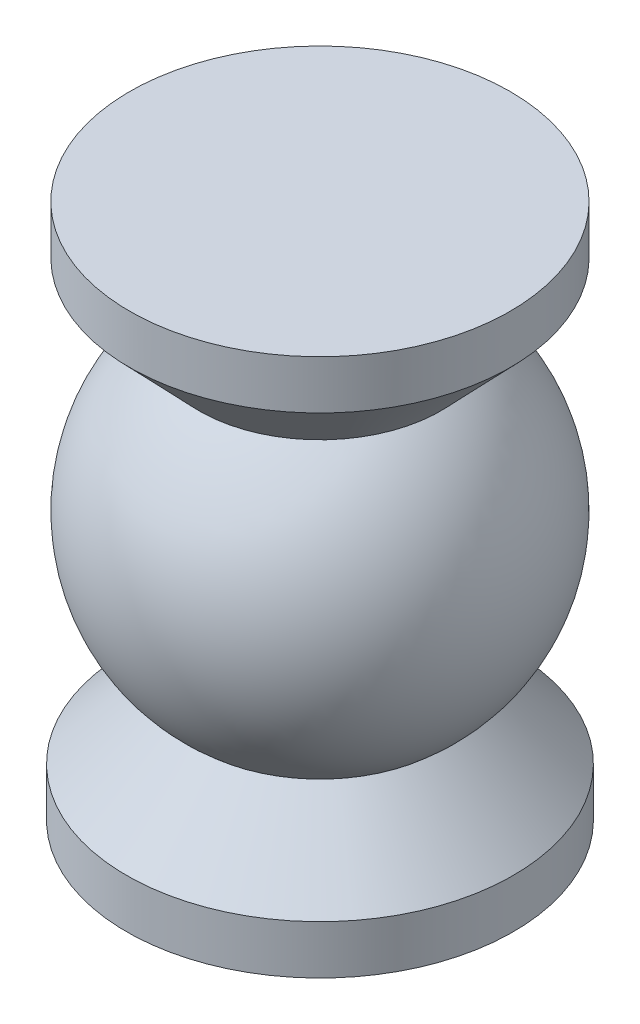
ISO-10303-21;
HEADER;
FILE_DESCRIPTION(('STEP AP214'),'2;1');
FILE_NAME('part.step','',(''),(''),'','','');
FILE_SCHEMA(('AUTOMOTIVE_DESIGN { 1 0 10303 214 1 1 1 1 }'));
ENDSEC;
DATA;
#1=APPLICATION_CONTEXT('core data for automotive mechanical design processes');
#2=APPLICATION_PROTOCOL_DEFINITION('international standard','automotive_design',2000,#1);
#3=PRODUCT_CONTEXT('',#1,'mechanical');
#4=PRODUCT('Part','Part','',(#3));
#5=PRODUCT_RELATED_PRODUCT_CATEGORY('part','',(#4));
#6=PRODUCT_DEFINITION_FORMATION('','',#4);
#7=PRODUCT_DEFINITION_CONTEXT('part definition',#1,'design');
#8=PRODUCT_DEFINITION('design','',#6,#7);
#9=PRODUCT_DEFINITION_SHAPE('','',#8);
#10=(LENGTH_UNIT() NAMED_UNIT(*) SI_UNIT(.MILLI.,.METRE.));
#11=(NAMED_UNIT(*) PLANE_ANGLE_UNIT() SI_UNIT($,.RADIAN.));
#12=(NAMED_UNIT(*) SI_UNIT($,.STERADIAN.) SOLID_ANGLE_UNIT());
#13=UNCERTAINTY_MEASURE_WITH_UNIT(LENGTH_MEASURE(1.E-05),#10,'distance_accuracy_value','');
#14=(GEOMETRIC_REPRESENTATION_CONTEXT(3) GLOBAL_UNCERTAINTY_ASSIGNED_CONTEXT((#13)) GLOBAL_UNIT_ASSIGNED_CONTEXT((#10,
#11,#12)) REPRESENTATION_CONTEXT('',''));
#15=CARTESIAN_POINT('',(0.,0.,0.));
#16=DIRECTION('',(0.,0.,1.));
#17=DIRECTION('',(1.,0.,0.));
#18=AXIS2_PLACEMENT_3D('',#15,#16,#17);
#19=CARTESIAN_POINT('',(-25.4000000000001,-34.4016735588106,0.));
#20=DIRECTION('',(0.,1.,0.));
#21=DIRECTION('',(0.,0.,1.));
#22=AXIS2_PLACEMENT_3D('',#19,#20,#21);
#23=PLANE('',#22);
#24=CARTESIAN_POINT('',(-1.00000000000001,-34.4016735588095,0.));
#25=DIRECTION('',(0.,-1.,0.));
#26=DIRECTION('',(0.,0.,-1.));
#27=AXIS2_PLACEMENT_3D('',#24,#25,#26);
#28=CIRCLE('',#27,25.4);
#29=CARTESIAN_POINT('',(-1.00000000000001,-34.4016735588095,-25.4));
#30=VERTEX_POINT('',#29);
#31=EDGE_CURVE('E94',#30,#30,#28,.T.);
#32=ORIENTED_EDGE('',*,*,#31,.T.);
#33=EDGE_LOOP('',(#32));
#34=FACE_BOUND('',#33,.T.);
#35=ADVANCED_FACE('F42',(#34),#23,.F.);
#36=CARTESIAN_POINT('',(-25.,36.0016735588097,0.));
#37=DIRECTION('',(0.,-1.,0.));
#38=DIRECTION('',(0.,0.,-1.));
#39=AXIS2_PLACEMENT_3D('',#36,#37,#38);
#40=PLANE('',#39);
#41=CARTESIAN_POINT('',(-1.00000000000001,36.0016735588097,0.));
#42=DIRECTION('',(0.,-1.,0.));
#43=DIRECTION('',(0.,0.,-1.));
#44=AXIS2_PLACEMENT_3D('',#41,#42,#43);
#45=CIRCLE('',#44,25.);
#46=CARTESIAN_POINT('',(-1.00000000000001,36.0016735588097,-25.));
#47=VERTEX_POINT('',#46);
#48=EDGE_CURVE('E74',#47,#47,#45,.T.);
#49=ORIENTED_EDGE('',*,*,#48,.F.);
#50=EDGE_LOOP('',(#49));
#51=FACE_BOUND('',#50,.T.);
#52=ADVANCED_FACE('F127',(#51),#40,.F.);
#53=CARTESIAN_POINT('',(-1.00000000000001,-999.2,0.));
#54=DIRECTION('',(0.,-1.,0.));
#55=DIRECTION('',(0.,0.,-1.));
#56=AXIS2_PLACEMENT_3D('',#53,#54,#55);
#57=CYLINDRICAL_SURFACE('',#56,25.);
#58=CARTESIAN_POINT('',(-1.00000000000001,29.5994118364477,0.));
#59=DIRECTION('',(0.,-1.,0.));
#60=DIRECTION('',(0.,0.,-1.));
#61=AXIS2_PLACEMENT_3D('',#58,#59,#60);
#62=CIRCLE('',#61,25.);
#63=CARTESIAN_POINT('',(-1.00000000000001,29.5994118364477,-25.));
#64=VERTEX_POINT('',#63);
#65=EDGE_CURVE('E78',#64,#64,#62,.T.);
#66=ORIENTED_EDGE('',*,*,#65,.F.);
#67=EDGE_LOOP('',(#66));
#68=FACE_BOUND('',#67,.T.);
#69=ORIENTED_EDGE('',*,*,#48,.T.);
#70=EDGE_LOOP('',(#69));
#71=FACE_BOUND('',#70,.T.);
#72=ADVANCED_FACE('F121',(#68,#71),#57,.T.);
#73=CARTESIAN_POINT('',(-1.00000000000001,29.5994118364477,0.));
#74=DIRECTION('',(0.,1.,0.));
#75=DIRECTION('',(0.,0.,1.));
#76=AXIS2_PLACEMENT_3D('',#73,#74,#75);
#77=CONICAL_SURFACE('',#76,25.,0.764909231725156);
#78=CARTESIAN_POINT('',(-1.00000000000001,20.1038960149712,0.));
#79=DIRECTION('',(0.,-1.,0.));
#80=DIRECTION('',(0.,0.,-1.));
#81=AXIS2_PLACEMENT_3D('',#78,#79,#80);
#82=CIRCLE('',#81,15.8858301213118);
#83=CARTESIAN_POINT('',(-16.8858301213119,20.1038960149712,0.));
#84=VERTEX_POINT('',#83);
#85=EDGE_CURVE('E82',#84,#84,#82,.T.);
#86=ORIENTED_EDGE('',*,*,#85,.F.);
#87=EDGE_LOOP('',(#86));
#88=FACE_BOUND('',#87,.T.);
#89=ORIENTED_EDGE('',*,*,#65,.T.);
#90=EDGE_LOOP('',(#89));
#91=FACE_BOUND('',#90,.T.);
#92=ADVANCED_FACE('F115',(#88,#91),#77,.T.);
#93=CARTESIAN_POINT('',(-1.00000000000001,0.800000000000002,0.));
#94=DIRECTION('',(0.,-1.,0.));
#95=DIRECTION('',(-1.,0.,0.));
#96=AXIS2_PLACEMENT_3D('',#93,#94,#95);
#97=SPHERICAL_SURFACE('',#96,25.);
#98=CARTESIAN_POINT('',(-1.00000000000001,-18.4893767310248,0.));
#99=DIRECTION('',(0.,-1.,0.));
#100=DIRECTION('',(0.,0.,-1.));
#101=AXIS2_PLACEMENT_3D('',#98,#99,#100);
#102=CIRCLE('',#101,15.9034570244522);
#103=CARTESIAN_POINT('',(-16.9034570244522,-18.4893767310248,0.));
#104=VERTEX_POINT('',#103);
#105=EDGE_CURVE('E86',#104,#104,#102,.T.);
#106=CARTESIAN_POINT('',(-16.9034570244522,-18.4893767310248,0.));
#107=CARTESIAN_POINT('',(-17.2578162967949,-18.1972370215747,0.));
#108=CARTESIAN_POINT('',(-17.6041070476047,-17.8953130350602,0.));
#109=CARTESIAN_POINT('',(-18.2795410880184,-17.2728578335224,0.));
#110=CARTESIAN_POINT('',(-18.6086843776225,-16.9523266184991,0.));
#111=CARTESIAN_POINT('',(-19.248813077485,-16.2936182855634,0.));
#112=CARTESIAN_POINT('',(-19.5597984877436,-15.9554411676511,0.));
#113=CARTESIAN_POINT('',(-20.1626700968582,-15.2624710737412,0.));
#114=CARTESIAN_POINT('',(-20.4545562957143,-14.9076780977437,0.));
#115=CARTESIAN_POINT('',(-21.0183424048437,-14.1825527286201,0.));
#116=CARTESIAN_POINT('',(-21.2902423151171,-13.8122203354942,0.));
#117=CARTESIAN_POINT('',(-21.8132304581927,-13.0571408440929,0.));
#118=CARTESIAN_POINT('',(-22.0643186909949,-12.6723937458177,0.));
#119=CARTESIAN_POINT('',(-22.5449210147059,-11.8896530338616,0.));
#120=CARTESIAN_POINT('',(-22.7744351056147,-11.4916594201808,0.));
#121=CARTESIAN_POINT('',(-23.2111922610482,-10.6836341670934,0.));
#122=CARTESIAN_POINT('',(-23.4184353255729,-10.2736025276869,0.));
#123=CARTESIAN_POINT('',(-23.8100211485234,-9.44274624434213,0.));
#124=CARTESIAN_POINT('',(-23.9943639069492,-9.02192160040382,0.));
#125=CARTESIAN_POINT('',(-24.3395893779495,-8.17075710681688,0.));
#126=CARTESIAN_POINT('',(-24.500472090524,-7.74041725716827,0.));
#127=CARTESIAN_POINT('',(-24.798288963086,-6.87152904158024,0.));
#128=CARTESIAN_POINT('',(-24.9352231230736,-6.43298067564083,0.));
#129=CARTESIAN_POINT('',(-25.1847271018055,-5.5490070417428,0.));
#130=CARTESIAN_POINT('',(-25.29729692055,-5.10358177378418,0.));
#131=CARTESIAN_POINT('',(-25.4977304082555,-4.2072068311298,0.));
#132=CARTESIAN_POINT('',(-25.5855940772166,-3.75625715643403,0.));
#133=CARTESIAN_POINT('',(-25.7363484749288,-2.85020266999959,0.));
#134=CARTESIAN_POINT('',(-25.7992392036799,-2.39509785826091,0.));
#135=CARTESIAN_POINT('',(-25.8998567587118,-1.48211498414141,0.));
#136=CARTESIAN_POINT('',(-25.9375835849926,-1.0242369217606,0.));
#137=CARTESIAN_POINT('',(-25.9877587808388,-0.107097853495433,0.));
#138=CARTESIAN_POINT('',(-26.0002071504043,0.352163152388925,0.));
#139=CARTESIAN_POINT('',(-25.9997876344222,1.27067360133477,0.));
#140=CARTESIAN_POINT('',(-25.9869197488747,1.72992304439626,0.));
#141=CARTESIAN_POINT('',(-25.9359067948883,2.64701589647946,0.));
#142=CARTESIAN_POINT('',(-25.8977617264495,3.10485930550117,0.));
#143=CARTESIAN_POINT('',(-25.7963102308817,4.01774988758816,0.));
#144=CARTESIAN_POINT('',(-25.7330038037526,4.47279706065344,0.));
#145=CARTESIAN_POINT('',(-25.5814218152969,5.37871345944163,0.));
#146=CARTESIAN_POINT('',(-25.4931462539702,5.82958268516454,0.));
#147=CARTESIAN_POINT('',(-25.2918940382213,6.72577416385011,0.));
#148=CARTESIAN_POINT('',(-25.1789173837991,7.17109641681276,0.));
#149=CARTESIAN_POINT('',(-24.9286060257208,8.0548417674919,0.));
#150=CARTESIAN_POINT('',(-24.7912713220648,8.49326486520838,0.));
#151=CARTESIAN_POINT('',(-24.4926608703911,9.36188067148964,0.));
#152=CARTESIAN_POINT('',(-24.3313851223736,9.79207338005442,0.));
#153=CARTESIAN_POINT('',(-23.9853822821305,10.6429221653942,0.));
#154=CARTESIAN_POINT('',(-23.8006551899049,11.0635782421692,0.));
#155=CARTESIAN_POINT('',(-23.4083105679957,11.8940764769466,0.));
#156=CARTESIAN_POINT('',(-23.200693038312,12.3039186349489,0.));
#157=CARTESIAN_POINT('',(-22.7631979582284,13.1115445863347,0.));
#158=CARTESIAN_POINT('',(-22.5333204078285,13.5093283797181,0.));
#159=CARTESIAN_POINT('',(-22.0520032744313,14.2916297492735,0.));
#160=CARTESIAN_POINT('',(-21.800563691434,14.6761473254455,0.));
#161=CARTESIAN_POINT('',(-21.2768860240528,15.4307487678099,0.));
#162=CARTESIAN_POINT('',(-21.0046479396688,15.8008326340024,0.));
#163=CARTESIAN_POINT('',(-20.4401996854488,16.5254426988663,0.));
#164=CARTESIAN_POINT('',(-20.1479895156129,16.8799688975376,0.));
#165=CARTESIAN_POINT('',(-19.5444851505958,17.5723879971696,0.));
#166=CARTESIAN_POINT('',(-19.2331909554146,17.9102808981303,0.));
#167=CARTESIAN_POINT('',(-18.5924608122864,18.5684042178459,0.));
#168=CARTESIAN_POINT('',(-18.2630248643393,18.8886346366008,0.));
#169=CARTESIAN_POINT('',(-17.5870225115396,19.5104725896725,0.));
#170=CARTESIAN_POINT('',(-17.240456106687,19.8120801239894,0.));
#171=CARTESIAN_POINT('',(-16.8858301213119,20.1038960149712,0.));
#172=B_SPLINE_CURVE_WITH_KNOTS('',3,(#106,#107,#108,#109,#110,#111,#112,#113,#114,#115,#116,
#117,#118,#119,#120,#121,#122,#123,#124,#125,#126,#127,#128,#129,#130,#131,#132,#133,#134,#135,
#136,#137,#138,#139,#140,#141,#142,#143,#144,#145,#146,#147,#148,#149,#150,#151,#152,#153,#154,
#155,#156,#157,#158,#159,#160,#161,#162,#163,#164,#165,#166,#167,#168,#169,#170,#171),
.UNSPECIFIED.,.F.,.F.,(4,2,2,2,2,2,2,2,2,2,2,2,2,2,2,2,2,2,2,2,2,2,2,2,2,2,2,2,2,2,2,2,4),(0.,
1.37759153912765,2.75518307825531,4.13277461738296,5.51036615651061,6.88795769563826,
8.26554923476592,9.64314077389357,11.0207323130212,12.3983238521489,13.7759153912765,
15.1535069304042,16.5310984695318,17.9086900086595,19.2862815477871,20.6638730869148,
22.0414646260424,23.4190561651701,24.7966477042977,26.1742392434254,27.5518307825531,
28.9294223216807,30.3070138608084,31.684605399936,33.0621969390637,34.4397884781913,
35.817380017319,37.1949715564466,38.5725630955743,39.9501546347019,41.3277461738296,
42.7053377129572,44.0829292520849),.UNSPECIFIED.);
#173=EDGE_CURVE('BSEAM109',#104,#84,#172,.T.);
#174=ORIENTED_EDGE('',*,*,#105,.F.);
#175=ORIENTED_EDGE('',*,*,#85,.T.);
#176=ORIENTED_EDGE('',*,*,#173,.T.);
#177=ORIENTED_EDGE('',*,*,#173,.F.);
#178=EDGE_LOOP('',(#174,#176,#175,#177));
#179=FACE_BOUND('',#178,.T.);
#180=ADVANCED_FACE('F109',(#179),#97,.T.);
#181=CARTESIAN_POINT('',(-1.00000000000001,-18.4893767310248,0.));
#182=DIRECTION('',(0.,-1.,0.));
#183=DIRECTION('',(0.,0.,-1.));
#184=AXIS2_PLACEMENT_3D('',#181,#182,#183);
#185=CONICAL_SURFACE('',#184,15.9034570244522,0.785314492458571);
#186=CARTESIAN_POINT('',(-1.00000000000001,-27.9875090088885,0.));
#187=DIRECTION('',(0.,-1.,0.));
#188=DIRECTION('',(0.,0.,-1.));
#189=AXIS2_PLACEMENT_3D('',#186,#187,#188);
#190=CIRCLE('',#189,25.4);
#191=CARTESIAN_POINT('',(-1.00000000000001,-27.9875090088885,-25.4));
#192=VERTEX_POINT('',#191);
#193=EDGE_CURVE('E90',#192,#192,#190,.T.);
#194=ORIENTED_EDGE('',*,*,#193,.F.);
#195=EDGE_LOOP('',(#194));
#196=FACE_BOUND('',#195,.T.);
#197=ORIENTED_EDGE('',*,*,#105,.T.);
#198=EDGE_LOOP('',(#197));
#199=FACE_BOUND('',#198,.T.);
#200=ADVANCED_FACE('F103',(#196,#199),#185,.T.);
#201=CARTESIAN_POINT('',(-1.00000000000001,-999.2,0.));
#202=DIRECTION('',(0.,-1.,0.));
#203=DIRECTION('',(0.,0.,-1.));
#204=AXIS2_PLACEMENT_3D('',#201,#202,#203);
#205=CYLINDRICAL_SURFACE('',#204,25.4);
#206=ORIENTED_EDGE('',*,*,#31,.F.);
#207=EDGE_LOOP('',(#206));
#208=FACE_BOUND('',#207,.T.);
#209=ORIENTED_EDGE('',*,*,#193,.T.);
#210=EDGE_LOOP('',(#209));
#211=FACE_BOUND('',#210,.T.);
#212=ADVANCED_FACE('F100',(#208,#211),#205,.T.);
#213=CLOSED_SHELL('',(#35,#52,#72,#92,#180,#200,#212));
#214=CARTESIAN_POINT('',(-25.4,-33.4016735588106,0.));
#215=DIRECTION('',(0.,1.,0.));
#216=DIRECTION('',(0.,0.,1.));
#217=AXIS2_PLACEMENT_3D('',#214,#215,#216);
#218=PLANE('',#217);
#219=CARTESIAN_POINT('',(-1.00000000000001,-33.4016735588096,0.));
#220=DIRECTION('',(0.,-1.,0.));
#221=DIRECTION('',(0.,0.,-1.));
#222=AXIS2_PLACEMENT_3D('',#219,#220,#221);
#223=CIRCLE('',#222,24.4);
#224=CARTESIAN_POINT('',(-1.00000000000001,-33.4016735588096,-24.4));
#225=VERTEX_POINT('',#224);
#226=EDGE_CURVE('E10',#225,#225,#223,.T.);
#227=ORIENTED_EDGE('',*,*,#226,.F.);
#228=EDGE_LOOP('',(#227));
#229=FACE_BOUND('',#228,.T.);
#230=ADVANCED_FACE('F159',(#229),#218,.T.);
#231=CARTESIAN_POINT('',(-1.00000000000001,-999.2,0.));
#232=DIRECTION('',(0.,-1.,0.));
#233=DIRECTION('',(0.,0.,-1.));
#234=AXIS2_PLACEMENT_3D('',#231,#232,#233);
#235=CYLINDRICAL_SURFACE('',#234,24.4);
#236=ORIENTED_EDGE('',*,*,#226,.T.);
#237=EDGE_LOOP('',(#236));
#238=FACE_BOUND('',#237,.T.);
#239=CARTESIAN_POINT('',(-1.00000000000001,-28.4016735588096,0.));
#240=DIRECTION('',(0.,-1.,0.));
#241=DIRECTION('',(0.,0.,-1.));
#242=AXIS2_PLACEMENT_3D('',#239,#240,#241);
#243=CIRCLE('',#242,24.4);
#244=CARTESIAN_POINT('',(-1.00000000000001,-28.4016735588096,-24.4));
#245=VERTEX_POINT('',#244);
#246=EDGE_CURVE('E50',#245,#245,#243,.T.);
#247=ORIENTED_EDGE('',*,*,#246,.F.);
#248=EDGE_LOOP('',(#247));
#249=FACE_BOUND('',#248,.T.);
#250=ADVANCED_FACE('F157',(#238,#249),#235,.F.);
#251=CARTESIAN_POINT('',(-1.00000000000001,-18.4,0.));
#252=DIRECTION('',(0.,-1.,0.));
#253=DIRECTION('',(0.,0.,-1.));
#254=AXIS2_PLACEMENT_3D('',#251,#252,#253);
#255=CONICAL_SURFACE('',#254,14.4,0.785314492458573);
#256=ORIENTED_EDGE('',*,*,#246,.T.);
#257=EDGE_LOOP('',(#256));
#258=FACE_BOUND('',#257,.T.);
#259=CARTESIAN_POINT('',(-1.00000000000001,-18.4,0.));
#260=DIRECTION('',(0.,-1.,0.));
#261=DIRECTION('',(0.,0.,-1.));
#262=AXIS2_PLACEMENT_3D('',#259,#260,#261);
#263=CIRCLE('',#262,14.4);
#264=CARTESIAN_POINT('',(-15.4000000000001,-18.4,0.));
#265=VERTEX_POINT('',#264);
#266=EDGE_CURVE('E55',#265,#265,#263,.T.);
#267=ORIENTED_EDGE('',*,*,#266,.F.);
#268=EDGE_LOOP('',(#267));
#269=FACE_BOUND('',#268,.T.);
#270=ADVANCED_FACE('F153',(#258,#269),#255,.F.);
#271=CARTESIAN_POINT('',(-1.00000000000001,0.800000000000002,0.));
#272=DIRECTION('',(0.,-1.,0.));
#273=DIRECTION('',(-1.,0.,0.));
#274=AXIS2_PLACEMENT_3D('',#271,#272,#273);
#275=SPHERICAL_SURFACE('',#274,24.);
#276=CARTESIAN_POINT('',(-1.00000000000001,19.9999999999999,0.));
#277=DIRECTION('',(0.,-1.,0.));
#278=DIRECTION('',(0.,0.,-1.));
#279=AXIS2_PLACEMENT_3D('',#276,#277,#278);
#280=CIRCLE('',#279,14.4);
#281=CARTESIAN_POINT('',(-15.4000000000001,19.9999999999999,0.));
#282=VERTEX_POINT('',#281);
#283=EDGE_CURVE('E60',#282,#282,#280,.T.);
#284=CARTESIAN_POINT('',(-15.4000000000001,-18.4,0.));
#285=CARTESIAN_POINT('',(-15.7709285224721,-18.1218238321915,0.));
#286=CARTESIAN_POINT('',(-16.133775332106,-17.8328747571581,0.));
#287=CARTESIAN_POINT('',(-16.8421330147961,-17.2344554167763,0.));
#288=CARTESIAN_POINT('',(-17.1876438878524,-16.9249851514279,0.));
#289=CARTESIAN_POINT('',(-17.8601571864858,-16.286548054551,0.));
#290=CARTESIAN_POINT('',(-18.187159612063,-15.9575812230224,0.));
#291=CARTESIAN_POINT('',(-18.8215612535109,-15.2812595506153,0.));
#292=CARTESIAN_POINT('',(-19.1289604693817,-14.9339047097368,0.));
#293=CARTESIAN_POINT('',(-19.7231225763077,-14.22197237406,0.));
#294=CARTESIAN_POINT('',(-20.0098854673628,-13.8573948792618,0.));
#295=CARTESIAN_POINT('',(-20.5618122252405,-13.1122417496914,0.));
#296=CARTESIAN_POINT('',(-20.8269760920629,-12.7316661149192,0.));
#297=CARTESIAN_POINT('',(-21.3348143304724,-11.9557945851246,0.));
#298=CARTESIAN_POINT('',(-21.5774887020596,-11.5604986901022,0.));
#299=CARTESIAN_POINT('',(-22.0395330780511,-10.7565140446395,0.));
#300=CARTESIAN_POINT('',(-22.2589030824555,-10.3478252941993,0.));
#301=CARTESIAN_POINT('',(-22.6736020855405,-9.51842728979871,0.));
#302=CARTESIAN_POINT('',(-22.8689310842212,-9.09771803583839,0.));
#303=CARTESIAN_POINT('',(-23.2348921716386,-8.24569174740509,0.));
#304=CARTESIAN_POINT('',(-23.4055242603754,-7.81437471293212,0.));
#305=CARTESIAN_POINT('',(-23.721518553181,-6.94258120506979,0.));
#306=CARTESIAN_POINT('',(-23.8668807572498,-6.50210473168044,0.));
#307=CARTESIAN_POINT('',(-24.1318471614747,-5.61347144503026,0.));
#308=CARTESIAN_POINT('',(-24.2514513616308,-5.16531463176945,0.));
#309=CARTESIAN_POINT('',(-24.4645001328202,-4.26282555450394,0.));
#310=CARTESIAN_POINT('',(-24.5579447038535,-3.80849329049925,0.));
#311=CARTESIAN_POINT('',(-24.718360434401,-2.89517893777722,0.));
#312=CARTESIAN_POINT('',(-24.7853315939153,-2.43619684905987,0.));
#313=CARTESIAN_POINT('',(-24.8925756154708,-1.51512408682338,0.));
#314=CARTESIAN_POINT('',(-24.9328484775121,-1.05303341330425,0.));
#315=CARTESIAN_POINT('',(-24.9865606697767,-0.127295159856764,0.));
#316=CARTESIAN_POINT('',(-25.,0.336352420071592,0.));
#317=CARTESIAN_POINT('',(-25.,1.26364757992831,0.));
#318=CARTESIAN_POINT('',(-24.9865606697767,1.72729515985666,0.));
#319=CARTESIAN_POINT('',(-24.9328484775121,2.65303341330415,0.));
#320=CARTESIAN_POINT('',(-24.8925756154708,3.11512408682328,0.));
#321=CARTESIAN_POINT('',(-24.7853315939153,4.03619684905976,0.));
#322=CARTESIAN_POINT('',(-24.718360434401,4.49517893777711,0.));
#323=CARTESIAN_POINT('',(-24.5579447038535,5.40849329049915,0.));
#324=CARTESIAN_POINT('',(-24.4645001328202,5.86282555450384,0.));
#325=CARTESIAN_POINT('',(-24.2514513616309,6.76531463176935,0.));
#326=CARTESIAN_POINT('',(-24.1318471614748,7.21347144503017,0.));
#327=CARTESIAN_POINT('',(-23.8668807572498,8.10210473168034,0.));
#328=CARTESIAN_POINT('',(-23.721518553181,8.5425812050697,0.));
#329=CARTESIAN_POINT('',(-23.4055242603754,9.41437471293202,0.));
#330=CARTESIAN_POINT('',(-23.2348921716386,9.845691747405,0.));
#331=CARTESIAN_POINT('',(-22.8689310842212,10.6977180358383,0.));
#332=CARTESIAN_POINT('',(-22.6736020855406,11.1184272897986,0.));
#333=CARTESIAN_POINT('',(-22.2589030824555,11.9478252941992,0.));
#334=CARTESIAN_POINT('',(-22.0395330780511,12.3565140446394,0.));
#335=CARTESIAN_POINT('',(-21.5774887020596,13.1604986901021,0.));
#336=CARTESIAN_POINT('',(-21.3348143304725,13.5557945851246,0.));
#337=CARTESIAN_POINT('',(-20.8269760920629,14.3316661149192,0.));
#338=CARTESIAN_POINT('',(-20.5618122252405,14.7122417496913,0.));
#339=CARTESIAN_POINT('',(-20.0098854673629,15.4573948792617,0.));
#340=CARTESIAN_POINT('',(-19.7231225763077,15.8219723740599,0.));
#341=CARTESIAN_POINT('',(-19.1289604693818,16.5339047097367,0.));
#342=CARTESIAN_POINT('',(-18.821561253511,16.8812595506152,0.));
#343=CARTESIAN_POINT('',(-18.1871596120631,17.5575812230223,0.));
#344=CARTESIAN_POINT('',(-17.8601571864859,17.8865480545509,0.));
#345=CARTESIAN_POINT('',(-17.1876438878525,18.5249851514278,0.));
#346=CARTESIAN_POINT('',(-16.8421330147962,18.8344554167762,0.));
#347=CARTESIAN_POINT('',(-16.133775332106,19.432874757158,0.));
#348=CARTESIAN_POINT('',(-15.7709285224721,19.7218238321914,0.));
#349=CARTESIAN_POINT('',(-15.4000000000001,19.9999999999999,0.));
#350=B_SPLINE_CURVE_WITH_KNOTS('',3,(#284,#285,#286,#287,#288,#289,#290,#291,#292,#293,#294,
#295,#296,#297,#298,#299,#300,#301,#302,#303,#304,#305,#306,#307,#308,#309,#310,#311,#312,#313,
#314,#315,#316,#317,#318,#319,#320,#321,#322,#323,#324,#325,#326,#327,#328,#329,#330,#331,#332,
#333,#334,#335,#336,#337,#338,#339,#340,#341,#342,#343,#344,#345,#346,#347,#348,#349),
.UNSPECIFIED.,.F.,.F.,(4,2,2,2,2,2,2,2,2,2,2,2,2,2,2,2,2,2,2,2,2,2,2,2,2,2,2,2,2,2,2,2,4),(0.,
1.39074816737932,2.78149633475864,4.17224450213796,5.56299266951727,6.95374083689659,
8.34448900427591,9.73523717165523,11.1259853390345,12.5167335064139,13.9074816737932,
15.2982298411725,16.6889780085518,18.0797261759311,19.4704743433105,20.8612225106898,
22.2519706780691,23.6427188454484,25.0334670128277,26.4242151802071,27.8149633475864,
29.2057115149657,30.596459682345,31.9872078497243,33.3779560171036,34.768704184483,
36.1594523518623,37.5502005192416,38.9409486866209,40.3316968540002,41.7224450213796,
43.1131931887589,44.5039413561382),.UNSPECIFIED.);
#351=EDGE_CURVE('BSEAM149',#265,#282,#350,.T.);
#352=ORIENTED_EDGE('',*,*,#266,.T.);
#353=ORIENTED_EDGE('',*,*,#283,.F.);
#354=ORIENTED_EDGE('',*,*,#351,.T.);
#355=ORIENTED_EDGE('',*,*,#351,.F.);
#356=EDGE_LOOP('',(#352,#354,#353,#355));
#357=FACE_BOUND('',#356,.T.);
#358=ADVANCED_FACE('F149',(#357),#275,.F.);
#359=CARTESIAN_POINT('',(-1.00000000000001,30.0016735588097,0.));
#360=DIRECTION('',(0.,1.,0.));
#361=DIRECTION('',(0.,0.,1.));
#362=AXIS2_PLACEMENT_3D('',#359,#360,#361);
#363=CONICAL_SURFACE('',#362,24.,0.764909231725145);
#364=ORIENTED_EDGE('',*,*,#283,.T.);
#365=EDGE_LOOP('',(#364));
#366=FACE_BOUND('',#365,.T.);
#367=CARTESIAN_POINT('',(-1.00000000000001,30.0016735588097,0.));
#368=DIRECTION('',(0.,-1.,0.));
#369=DIRECTION('',(0.,0.,-1.));
#370=AXIS2_PLACEMENT_3D('',#367,#368,#369);
#371=CIRCLE('',#370,24.);
#372=CARTESIAN_POINT('',(-1.00000000000001,30.0016735588097,-24.));
#373=VERTEX_POINT('',#372);
#374=EDGE_CURVE('E66',#373,#373,#371,.T.);
#375=ORIENTED_EDGE('',*,*,#374,.F.);
#376=EDGE_LOOP('',(#375));
#377=FACE_BOUND('',#376,.T.);
#378=ADVANCED_FACE('F145',(#366,#377),#363,.F.);
#379=CARTESIAN_POINT('',(-1.00000000000001,-999.2,0.));
#380=DIRECTION('',(0.,-1.,0.));
#381=DIRECTION('',(0.,0.,-1.));
#382=AXIS2_PLACEMENT_3D('',#379,#380,#381);
#383=CYLINDRICAL_SURFACE('',#382,24.);
#384=ORIENTED_EDGE('',*,*,#374,.T.);
#385=EDGE_LOOP('',(#384));
#386=FACE_BOUND('',#385,.T.);
#387=CARTESIAN_POINT('',(-1.00000000000001,35.0016735588096,0.));
#388=DIRECTION('',(0.,-1.,0.));
#389=DIRECTION('',(0.,0.,-1.));
#390=AXIS2_PLACEMENT_3D('',#387,#388,#389);
#391=CIRCLE('',#390,24.);
#392=CARTESIAN_POINT('',(-1.00000000000001,35.0016735588096,-24.));
#393=VERTEX_POINT('',#392);
#394=EDGE_CURVE('E70',#393,#393,#391,.T.);
#395=ORIENTED_EDGE('',*,*,#394,.F.);
#396=EDGE_LOOP('',(#395));
#397=FACE_BOUND('',#396,.T.);
#398=ADVANCED_FACE('F140',(#386,#397),#383,.F.);
#399=CARTESIAN_POINT('',(-25.,35.0016735588097,0.));
#400=DIRECTION('',(0.,-1.,0.));
#401=DIRECTION('',(0.,0.,-1.));
#402=AXIS2_PLACEMENT_3D('',#399,#400,#401);
#403=PLANE('',#402);
#404=ORIENTED_EDGE('',*,*,#394,.T.);
#405=EDGE_LOOP('',(#404));
#406=FACE_BOUND('',#405,.T.);
#407=ADVANCED_FACE('F137',(#406),#403,.T.);
#408=CLOSED_SHELL('',(#230,#250,#270,#358,#378,#398,#407));
#409=ORIENTED_CLOSED_SHELL('',*,#408,.T.);
#410=BREP_WITH_VOIDS('B2',#213,(#409));
#411=ADVANCED_BREP_SHAPE_REPRESENTATION('',(#18,#410),#14);
#412=SHAPE_DEFINITION_REPRESENTATION(#9,#411);
ENDSEC;
END-ISO-10303-21;
